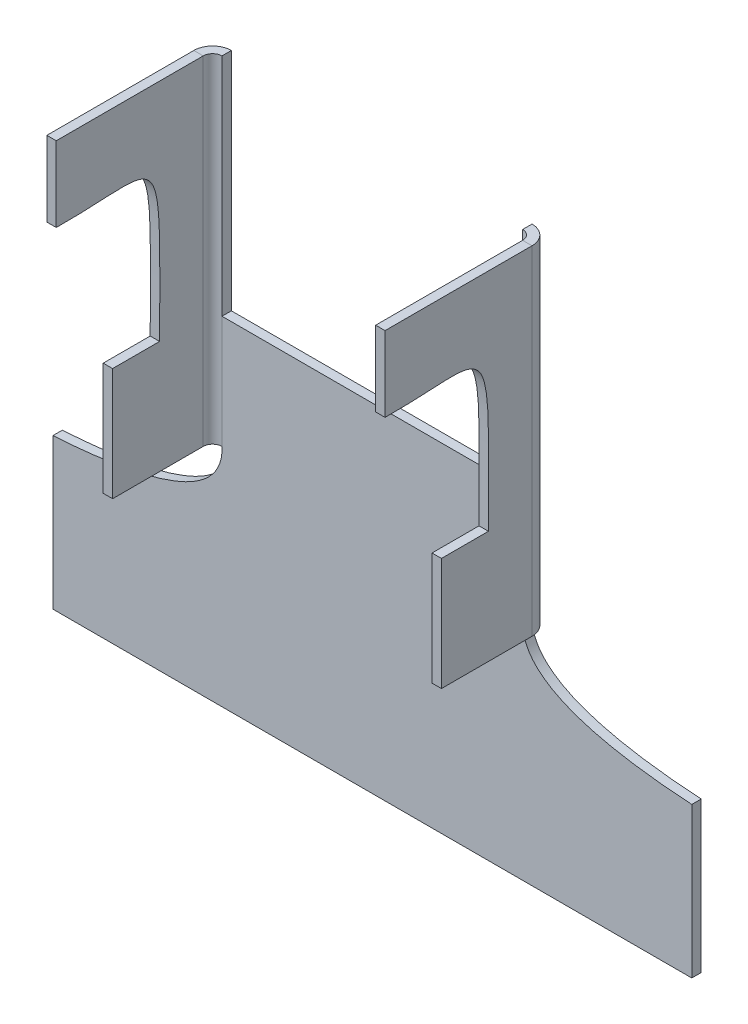
ISO-10303-21;
HEADER;
FILE_DESCRIPTION(('STEP AP214'),'2;1');
FILE_NAME('part.step','',(''),(''),'','','');
FILE_SCHEMA(('AUTOMOTIVE_DESIGN { 1 0 10303 214 1 1 1 1 }'));
ENDSEC;
DATA;
#1=APPLICATION_CONTEXT('core data for automotive mechanical design processes');
#2=APPLICATION_PROTOCOL_DEFINITION('international standard','automotive_design',2000,#1);
#3=PRODUCT_CONTEXT('',#1,'mechanical');
#4=PRODUCT('Part','Part','',(#3));
#5=PRODUCT_RELATED_PRODUCT_CATEGORY('part','',(#4));
#6=PRODUCT_DEFINITION_FORMATION('','',#4);
#7=PRODUCT_DEFINITION_CONTEXT('part definition',#1,'design');
#8=PRODUCT_DEFINITION('design','',#6,#7);
#9=PRODUCT_DEFINITION_SHAPE('','',#8);
#10=(LENGTH_UNIT() NAMED_UNIT(*) SI_UNIT(.MILLI.,.METRE.));
#11=(NAMED_UNIT(*) PLANE_ANGLE_UNIT() SI_UNIT($,.RADIAN.));
#12=(NAMED_UNIT(*) SI_UNIT($,.STERADIAN.) SOLID_ANGLE_UNIT());
#13=UNCERTAINTY_MEASURE_WITH_UNIT(LENGTH_MEASURE(1.E-05),#10,'distance_accuracy_value','');
#14=(GEOMETRIC_REPRESENTATION_CONTEXT(3) GLOBAL_UNCERTAINTY_ASSIGNED_CONTEXT((#13)) GLOBAL_UNIT_ASSIGNED_CONTEXT((#10,
#11,#12)) REPRESENTATION_CONTEXT('',''));
#15=CARTESIAN_POINT('',(0.,0.,0.));
#16=DIRECTION('',(0.,0.,1.));
#17=DIRECTION('',(1.,0.,0.));
#18=AXIS2_PLACEMENT_3D('',#15,#16,#17);
#19=CARTESIAN_POINT('',(84.8300814883763,84.4847846617925,-3.175));
#20=DIRECTION('',(0.,0.,1.));
#21=DIRECTION('',(1.,0.,0.));
#22=AXIS2_PLACEMENT_3D('',#19,#20,#21);
#23=PLANE('',#22);
#24=DIRECTION('',(-1.,0.,0.));
#25=VECTOR('',#24,1.);
#26=CARTESIAN_POINT('',(-42.4525662577424,35.8220109467431,-3.175));
#27=LINE('',#26,#25);
#28=CARTESIAN_POINT('',(59.1474337422576,35.8220109467432,-3.175));
#29=VERTEX_POINT('',#28);
#30=CARTESIAN_POINT('',(-42.4525662577424,35.8220109467431,-3.175));
#31=VERTEX_POINT('',#30);
#32=EDGE_CURVE('E69',#29,#31,#27,.T.);
#33=ORIENTED_EDGE('',*,*,#32,.F.);
#34=DIRECTION('',(0.,-1.,0.));
#35=VECTOR('',#34,1.);
#36=CARTESIAN_POINT('',(59.1474337422576,84.4847846617925,-3.175));
#37=LINE('',#36,#35);
#38=CARTESIAN_POINT('',(59.1474337422576,-2.27798905325685,-3.175));
#39=VERTEX_POINT('',#38);
#40=EDGE_CURVE('E386',#29,#39,#37,.T.);
#41=ORIENTED_EDGE('',*,*,#40,.T.);
#42=CARTESIAN_POINT('',(116.297433742258,-27.6779890532568,-3.175));
#43=CARTESIAN_POINT('',(58.2426435123151,-24.0057964597718,-3.175));
#44=CARTESIAN_POINT('',(59.1474337422576,-2.27798905325685,-3.175));
#45=B_SPLINE_CURVE_WITH_KNOTS('',2,(#42,#43,#44),.UNSPECIFIED.,.F.,.F.,(3,3),(0.,1.),.UNSPECIFIED.);
#46=CARTESIAN_POINT('',(116.297433742258,-27.6779890532569,-3.175));
#47=VERTEX_POINT('',#46);
#48=EDGE_CURVE('E277',#47,#39,#45,.T.);
#49=ORIENTED_EDGE('',*,*,#48,.F.);
#50=DIRECTION('',(0.,1.,0.));
#51=VECTOR('',#50,1.);
#52=CARTESIAN_POINT('',(116.297433742258,-78.4779890532568,-3.175));
#53=LINE('',#52,#51);
#54=CARTESIAN_POINT('',(116.297433742258,-78.4779890532568,-3.175));
#55=VERTEX_POINT('',#54);
#56=EDGE_CURVE('E513',#55,#47,#53,.T.);
#57=ORIENTED_EDGE('',*,*,#56,.F.);
#58=DIRECTION('',(1.,0.,0.));
#59=VECTOR('',#58,1.);
#60=CARTESIAN_POINT('',(-99.6025662577424,-78.4779890532568,-3.175));
#61=LINE('',#60,#59);
#62=CARTESIAN_POINT('',(-99.6025662577424,-78.4779890532568,-3.175));
#63=VERTEX_POINT('',#62);
#64=EDGE_CURVE('E517',#63,#55,#61,.T.);
#65=ORIENTED_EDGE('',*,*,#64,.F.);
#66=DIRECTION('',(0.,-1.,0.));
#67=VECTOR('',#66,1.);
#68=CARTESIAN_POINT('',(-99.6025662577424,-78.4779890532568,-3.175));
#69=LINE('',#68,#67);
#70=CARTESIAN_POINT('',(-99.6025662577424,-27.6779890532569,-3.175));
#71=VERTEX_POINT('',#70);
#72=EDGE_CURVE('E488',#71,#63,#69,.T.);
#73=ORIENTED_EDGE('',*,*,#72,.F.);
#74=CARTESIAN_POINT('',(-42.4525662577424,-2.27798905325686,-3.175));
#75=CARTESIAN_POINT('',(-41.5477760277999,-24.0057964597718,-3.175));
#76=CARTESIAN_POINT('',(-99.6025662577424,-27.6779890532569,-3.175));
#77=B_SPLINE_CURVE_WITH_KNOTS('',2,(#74,#75,#76),.UNSPECIFIED.,.F.,.F.,(3,3),(0.,1.),.UNSPECIFIED.);
#78=CARTESIAN_POINT('',(-42.4525662577424,-2.27798905325687,-3.175));
#79=VERTEX_POINT('',#78);
#80=EDGE_CURVE('E285',#79,#71,#77,.T.);
#81=ORIENTED_EDGE('',*,*,#80,.F.);
#82=DIRECTION('',(0.,1.,0.));
#83=VECTOR('',#82,1.);
#84=CARTESIAN_POINT('',(-42.4525662577424,84.4847846617926,-3.175));
#85=LINE('',#84,#83);
#86=EDGE_CURVE('E283',#79,#31,#85,.T.);
#87=ORIENTED_EDGE('',*,*,#86,.T.);
#88=EDGE_LOOP('',(#33,#41,#49,#57,#65,#73,#81,#87));
#89=FACE_BOUND('',#88,.T.);
#90=ADVANCED_FACE('F45',(#89),#23,.F.);
#91=CARTESIAN_POINT('',(-48.8025662577422,112.022010946743,52.8440824936393));
#92=DIRECTION('',(0.,1.,0.));
#93=DIRECTION('',(1.,0.,0.));
#94=AXIS2_PLACEMENT_3D('',#91,#92,#93);
#95=PLANE('',#94);
#96=DIRECTION('',(0.,0.,1.));
#97=VECTOR('',#96,1.);
#98=CARTESIAN_POINT('',(-45.6275662577422,112.022010946743,52.8440824936393));
#99=LINE('',#98,#97);
#100=CARTESIAN_POINT('',(-45.6275662577424,112.022010946743,3.175));
#101=VERTEX_POINT('',#100);
#102=CARTESIAN_POINT('',(-45.6275662577422,112.022010946743,52.8440824936393));
#103=VERTEX_POINT('',#102);
#104=EDGE_CURVE('E349',#101,#103,#99,.T.);
#105=ORIENTED_EDGE('',*,*,#104,.F.);
#106=DIRECTION('',(-1.,0.,0.));
#107=VECTOR('',#106,1.);
#108=CARTESIAN_POINT('',(-48.8025662577424,112.022010946743,3.17500000000001));
#109=LINE('',#108,#107);
#110=CARTESIAN_POINT('',(-48.8025662577424,112.022010946743,3.17500000000004));
#111=VERTEX_POINT('',#110);
#112=EDGE_CURVE('E378',#101,#111,#109,.T.);
#113=ORIENTED_EDGE('',*,*,#112,.T.);
#114=DIRECTION('',(0.,0.,1.));
#115=VECTOR('',#114,1.);
#116=CARTESIAN_POINT('',(-48.8025662577422,112.022010946743,52.8440824936393));
#117=LINE('',#116,#115);
#118=CARTESIAN_POINT('',(-48.8025662577422,112.022010946743,52.8440824936393));
#119=VERTEX_POINT('',#118);
#120=EDGE_CURVE('E392',#111,#119,#117,.T.);
#121=ORIENTED_EDGE('',*,*,#120,.T.);
#122=DIRECTION('',(1.,0.,0.));
#123=VECTOR('',#122,1.);
#124=CARTESIAN_POINT('',(-48.8025662577422,112.022010946743,52.8440824936393));
#125=LINE('',#124,#123);
#126=EDGE_CURVE('E373',#119,#103,#125,.T.);
#127=ORIENTED_EDGE('',*,*,#126,.T.);
#128=EDGE_LOOP('',(#105,#113,#121,#127));
#129=FACE_BOUND('',#128,.T.);
#130=ADVANCED_FACE('F557',(#129),#95,.T.);
#131=CARTESIAN_POINT('',(-48.8025662577423,-2.27798905325687,33.7940824936393));
#132=DIRECTION('',(0.,-1.,0.));
#133=DIRECTION('',(-1.,0.,0.));
#134=AXIS2_PLACEMENT_3D('',#131,#132,#133);
#135=PLANE('',#134);
#136=DIRECTION('',(0.,0.,-1.));
#137=VECTOR('',#136,1.);
#138=CARTESIAN_POINT('',(-48.8025662577423,-2.27798905325687,33.7940824936393));
#139=LINE('',#138,#137);
#140=CARTESIAN_POINT('',(-48.8025662577423,-2.27798905325687,33.7940824936393));
#141=VERTEX_POINT('',#140);
#142=CARTESIAN_POINT('',(-48.8025662577424,-2.27798905325686,3.17499999999998));
#143=VERTEX_POINT('',#142);
#144=EDGE_CURVE('E344',#141,#143,#139,.T.);
#145=ORIENTED_EDGE('',*,*,#144,.T.);
#146=DIRECTION('',(1.,0.,0.));
#147=VECTOR('',#146,1.);
#148=CARTESIAN_POINT('',(-48.8025662577424,-2.27798905325686,3.17500000000001));
#149=LINE('',#148,#147);
#150=CARTESIAN_POINT('',(-45.6275662577424,-2.27798905325686,3.175));
#151=VERTEX_POINT('',#150);
#152=EDGE_CURVE('E383',#143,#151,#149,.T.);
#153=ORIENTED_EDGE('',*,*,#152,.T.);
#154=DIRECTION('',(0.,0.,-1.));
#155=VECTOR('',#154,1.);
#156=CARTESIAN_POINT('',(-45.6275662577423,-2.27798905325687,33.7940824936393));
#157=LINE('',#156,#155);
#158=CARTESIAN_POINT('',(-45.6275662577423,-2.27798905325687,33.7940824936393));
#159=VERTEX_POINT('',#158);
#160=EDGE_CURVE('E363',#159,#151,#157,.T.);
#161=ORIENTED_EDGE('',*,*,#160,.F.);
#162=DIRECTION('',(1.,0.,0.));
#163=VECTOR('',#162,1.);
#164=CARTESIAN_POINT('',(-48.8025662577423,-2.27798905325687,33.7940824936393));
#165=LINE('',#164,#163);
#166=EDGE_CURVE('E364',#141,#159,#165,.T.);
#167=ORIENTED_EDGE('',*,*,#166,.F.);
#168=EDGE_LOOP('',(#145,#153,#161,#167));
#169=FACE_BOUND('',#168,.T.);
#170=ADVANCED_FACE('F570',(#169),#135,.T.);
#171=CARTESIAN_POINT('',(-45.6275662577429,84.4847846617926,-131.588565252479));
#172=DIRECTION('',(1.,0.,0.));
#173=DIRECTION('',(0.,0.,-1.));
#174=AXIS2_PLACEMENT_3D('',#171,#172,#173);
#175=PLANE('',#174);
#176=ORIENTED_EDGE('',*,*,#160,.T.);
#177=DIRECTION('',(0.,1.,0.));
#178=VECTOR('',#177,1.);
#179=CARTESIAN_POINT('',(-45.6275662577424,84.4847846617926,3.17499999999998));
#180=LINE('',#179,#178);
#181=EDGE_CURVE('E380',#151,#101,#180,.T.);
#182=ORIENTED_EDGE('',*,*,#181,.T.);
#183=ORIENTED_EDGE('',*,*,#104,.T.);
#184=DIRECTION('',(0.,-1.,0.));
#185=VECTOR('',#184,1.);
#186=CARTESIAN_POINT('',(-45.6275662577422,112.022010946743,52.8440824936393));
#187=LINE('',#186,#185);
#188=CARTESIAN_POINT('',(-45.6275662577422,86.6220109467431,52.8440824936393));
#189=VERTEX_POINT('',#188);
#190=EDGE_CURVE('E345',#103,#189,#187,.T.);
#191=ORIENTED_EDGE('',*,*,#190,.T.);
#192=CARTESIAN_POINT('',(-45.6275662577422,86.6220109467431,52.8440824936393));
#193=CARTESIAN_POINT('',(-45.6275662577424,86.0916431492241,15.7336539194704));
#194=CARTESIAN_POINT('',(-45.6275662577424,98.3864419843938,17.6832383907914));
#195=CARTESIAN_POINT('',(-45.6275662577424,35.8220109467431,17.9190824936393));
#196=B_SPLINE_CURVE_WITH_KNOTS('',3,(#192,#193,#194,#195),.UNSPECIFIED.,.F.,.F.,(4,4),(0.,1.),.UNSPECIFIED.);
#197=CARTESIAN_POINT('',(-45.6275662577424,35.8220109467431,17.9190824936393));
#198=VERTEX_POINT('',#197);
#199=EDGE_CURVE('E348',#189,#198,#196,.T.);
#200=ORIENTED_EDGE('',*,*,#199,.T.);
#201=DIRECTION('',(0.,0.,1.));
#202=VECTOR('',#201,1.);
#203=CARTESIAN_POINT('',(-45.6275662577423,35.8220109467431,33.7940824936393));
#204=LINE('',#203,#202);
#205=CARTESIAN_POINT('',(-45.6275662577423,35.8220109467431,33.7940824936393));
#206=VERTEX_POINT('',#205);
#207=EDGE_CURVE('E354',#198,#206,#204,.T.);
#208=ORIENTED_EDGE('',*,*,#207,.T.);
#209=DIRECTION('',(0.,-1.,0.));
#210=VECTOR('',#209,1.);
#211=CARTESIAN_POINT('',(-45.6275662577423,-2.27798905325687,33.7940824936393));
#212=LINE('',#211,#210);
#213=EDGE_CURVE('E360',#206,#159,#212,.T.);
#214=ORIENTED_EDGE('',*,*,#213,.T.);
#215=EDGE_LOOP('',(#176,#182,#183,#191,#200,#208,#214));
#216=FACE_BOUND('',#215,.T.);
#217=ADVANCED_FACE('F314',(#216),#175,.T.);
#218=CARTESIAN_POINT('',(-48.8025662577423,-2.27798905325687,33.7940824936393));
#219=DIRECTION('',(0.,0.,1.));
#220=DIRECTION('',(1.,0.,0.));
#221=AXIS2_PLACEMENT_3D('',#218,#219,#220);
#222=PLANE('',#221);
#223=ORIENTED_EDGE('',*,*,#213,.F.);
#224=DIRECTION('',(1.,0.,0.));
#225=VECTOR('',#224,1.);
#226=CARTESIAN_POINT('',(-48.8025662577423,35.8220109467431,33.7940824936393));
#227=LINE('',#226,#225);
#228=CARTESIAN_POINT('',(-48.8025662577423,35.8220109467431,33.7940824936393));
#229=VERTEX_POINT('',#228);
#230=EDGE_CURVE('E367',#229,#206,#227,.T.);
#231=ORIENTED_EDGE('',*,*,#230,.F.);
#232=DIRECTION('',(0.,-1.,0.));
#233=VECTOR('',#232,1.);
#234=CARTESIAN_POINT('',(-48.8025662577423,-2.27798905325687,33.7940824936393));
#235=LINE('',#234,#233);
#236=EDGE_CURVE('E341',#229,#141,#235,.T.);
#237=ORIENTED_EDGE('',*,*,#236,.T.);
#238=ORIENTED_EDGE('',*,*,#166,.T.);
#239=EDGE_LOOP('',(#223,#231,#237,#238));
#240=FACE_BOUND('',#239,.T.);
#241=ADVANCED_FACE('F310',(#240),#222,.T.);
#242=CARTESIAN_POINT('',(-48.8025662577423,35.8220109467431,33.7940824936393));
#243=DIRECTION('',(0.,1.,0.));
#244=DIRECTION('',(1.,0.,0.));
#245=AXIS2_PLACEMENT_3D('',#242,#243,#244);
#246=PLANE('',#245);
#247=ORIENTED_EDGE('',*,*,#207,.F.);
#248=DIRECTION('',(1.,0.,0.));
#249=VECTOR('',#248,1.);
#250=CARTESIAN_POINT('',(-48.8025662577424,35.8220109467431,17.9190824936393));
#251=LINE('',#250,#249);
#252=CARTESIAN_POINT('',(-48.8025662577424,35.8220109467431,17.9190824936393));
#253=VERTEX_POINT('',#252);
#254=EDGE_CURVE('E369',#253,#198,#251,.T.);
#255=ORIENTED_EDGE('',*,*,#254,.F.);
#256=DIRECTION('',(0.,0.,1.));
#257=VECTOR('',#256,1.);
#258=CARTESIAN_POINT('',(-48.8025662577423,35.8220109467431,33.7940824936393));
#259=LINE('',#258,#257);
#260=EDGE_CURVE('E333',#253,#229,#259,.T.);
#261=ORIENTED_EDGE('',*,*,#260,.T.);
#262=ORIENTED_EDGE('',*,*,#230,.T.);
#263=EDGE_LOOP('',(#247,#255,#261,#262));
#264=FACE_BOUND('',#263,.T.);
#265=ADVANCED_FACE('F313',(#264),#246,.T.);
#266=CARTESIAN_POINT('',(-48.8025662577422,86.6220109467431,52.8440824936393));
#267=CARTESIAN_POINT('',(-48.8025662577424,86.0916431492241,15.7336539194704));
#268=CARTESIAN_POINT('',(-48.8025662577424,98.3864419843938,17.6832383907915));
#269=CARTESIAN_POINT('',(-48.8025662577424,35.8220109467431,17.9190824936393));
#270=B_SPLINE_CURVE_WITH_KNOTS('',3,(#266,#267,#268,#269),.UNSPECIFIED.,.F.,.F.,(4,4),(0.,1.),.UNSPECIFIED.);
#271=DIRECTION('',(1.,0.,0.));
#272=VECTOR('',#271,1.);
#273=SURFACE_OF_LINEAR_EXTRUSION('',#270,#272);
#274=ORIENTED_EDGE('',*,*,#199,.F.);
#275=DIRECTION('',(1.,0.,0.));
#276=VECTOR('',#275,1.);
#277=CARTESIAN_POINT('',(-48.8025662577422,86.6220109467431,52.8440824936393));
#278=LINE('',#277,#276);
#279=CARTESIAN_POINT('',(-48.8025662577422,86.6220109467431,52.8440824936393));
#280=VERTEX_POINT('',#279);
#281=EDGE_CURVE('E371',#280,#189,#278,.T.);
#282=ORIENTED_EDGE('',*,*,#281,.F.);
#283=EDGE_CURVE('E326',#280,#253,#270,.T.);
#284=ORIENTED_EDGE('',*,*,#283,.T.);
#285=ORIENTED_EDGE('',*,*,#254,.T.);
#286=EDGE_LOOP('',(#274,#282,#284,#285));
#287=FACE_BOUND('',#286,.T.);
#288=ADVANCED_FACE('F318',(#287),#273,.T.);
#289=CARTESIAN_POINT('',(-48.8025662577422,112.022010946743,52.8440824936393));
#290=DIRECTION('',(0.,0.,1.));
#291=DIRECTION('',(0.,-1.,0.));
#292=AXIS2_PLACEMENT_3D('',#289,#290,#291);
#293=PLANE('',#292);
#294=ORIENTED_EDGE('',*,*,#190,.F.);
#295=ORIENTED_EDGE('',*,*,#126,.F.);
#296=DIRECTION('',(0.,-1.,0.));
#297=VECTOR('',#296,1.);
#298=CARTESIAN_POINT('',(-48.8025662577422,112.022010946743,52.8440824936393));
#299=LINE('',#298,#297);
#300=EDGE_CURVE('E334',#119,#280,#299,.T.);
#301=ORIENTED_EDGE('',*,*,#300,.T.);
#302=ORIENTED_EDGE('',*,*,#281,.T.);
#303=EDGE_LOOP('',(#294,#295,#301,#302));
#304=FACE_BOUND('',#303,.T.);
#305=ADVANCED_FACE('F323',(#304),#293,.T.);
#306=CARTESIAN_POINT('',(-48.8025662577429,84.4847846617926,-131.588565252479));
#307=DIRECTION('',(1.,0.,0.));
#308=DIRECTION('',(0.,0.,-1.));
#309=AXIS2_PLACEMENT_3D('',#306,#307,#308);
#310=PLANE('',#309);
#311=DIRECTION('',(0.,1.,0.));
#312=VECTOR('',#311,1.);
#313=CARTESIAN_POINT('',(-48.8025662577424,84.4847846617926,3.175));
#314=LINE('',#313,#312);
#315=EDGE_CURVE('E366',#143,#111,#314,.T.);
#316=ORIENTED_EDGE('',*,*,#315,.F.);
#317=ORIENTED_EDGE('',*,*,#144,.F.);
#318=ORIENTED_EDGE('',*,*,#236,.F.);
#319=ORIENTED_EDGE('',*,*,#260,.F.);
#320=ORIENTED_EDGE('',*,*,#283,.F.);
#321=ORIENTED_EDGE('',*,*,#300,.F.);
#322=ORIENTED_EDGE('',*,*,#120,.F.);
#323=EDGE_LOOP('',(#316,#317,#318,#319,#320,#321,#322));
#324=FACE_BOUND('',#323,.T.);
#325=ADVANCED_FACE('F561',(#324),#310,.F.);
#326=CARTESIAN_POINT('',(-99.6025662577424,-78.4779890532568,-3.175));
#327=DIRECTION('',(-1.,0.,0.));
#328=DIRECTION('',(0.,0.,1.));
#329=AXIS2_PLACEMENT_3D('',#326,#327,#328);
#330=PLANE('',#329);
#331=DIRECTION('',(0.,-1.,0.));
#332=VECTOR('',#331,1.);
#333=CARTESIAN_POINT('',(-99.6025662577424,-78.4779890532568,0.));
#334=LINE('',#333,#332);
#335=CARTESIAN_POINT('',(-99.6025662577424,-27.6779890532569,0.));
#336=VERTEX_POINT('',#335);
#337=CARTESIAN_POINT('',(-99.6025662577424,-78.4779890532568,0.));
#338=VERTEX_POINT('',#337);
#339=EDGE_CURVE('E541',#336,#338,#334,.T.);
#340=ORIENTED_EDGE('',*,*,#339,.F.);
#341=DIRECTION('',(0.,0.,1.));
#342=VECTOR('',#341,1.);
#343=CARTESIAN_POINT('',(-99.6025662577424,-27.6779890532569,-3.175));
#344=LINE('',#343,#342);
#345=EDGE_CURVE('E390',#71,#336,#344,.T.);
#346=ORIENTED_EDGE('',*,*,#345,.F.);
#347=ORIENTED_EDGE('',*,*,#72,.T.);
#348=DIRECTION('',(0.,0.,1.));
#349=VECTOR('',#348,1.);
#350=CARTESIAN_POINT('',(-99.6025662577424,-78.4779890532568,-3.175));
#351=LINE('',#350,#349);
#352=EDGE_CURVE('E519',#63,#338,#351,.T.);
#353=ORIENTED_EDGE('',*,*,#352,.T.);
#354=EDGE_LOOP('',(#340,#346,#347,#353));
#355=FACE_BOUND('',#354,.T.);
#356=ADVANCED_FACE('F525',(#355),#330,.T.);
#357=CARTESIAN_POINT('',(-99.6025662577424,-78.4779890532568,-3.175));
#358=DIRECTION('',(0.,-1.,0.));
#359=DIRECTION('',(0.,0.,-1.));
#360=AXIS2_PLACEMENT_3D('',#357,#358,#359);
#361=PLANE('',#360);
#362=DIRECTION('',(1.,0.,0.));
#363=VECTOR('',#362,1.);
#364=CARTESIAN_POINT('',(-99.6025662577424,-78.4779890532568,0.));
#365=LINE('',#364,#363);
#366=CARTESIAN_POINT('',(116.297433742258,-78.4779890532568,0.));
#367=VERTEX_POINT('',#366);
#368=EDGE_CURVE('E539',#338,#367,#365,.T.);
#369=ORIENTED_EDGE('',*,*,#368,.F.);
#370=ORIENTED_EDGE('',*,*,#352,.F.);
#371=ORIENTED_EDGE('',*,*,#64,.T.);
#372=DIRECTION('',(0.,0.,1.));
#373=VECTOR('',#372,1.);
#374=CARTESIAN_POINT('',(116.297433742258,-78.4779890532568,-3.175));
#375=LINE('',#374,#373);
#376=EDGE_CURVE('E515',#55,#367,#375,.T.);
#377=ORIENTED_EDGE('',*,*,#376,.T.);
#378=EDGE_LOOP('',(#369,#370,#371,#377));
#379=FACE_BOUND('',#378,.T.);
#380=ADVANCED_FACE('F631',(#379),#361,.T.);
#381=CARTESIAN_POINT('',(116.297433742258,-78.4779890532568,-3.175));
#382=DIRECTION('',(1.,0.,0.));
#383=DIRECTION('',(0.,0.,-1.));
#384=AXIS2_PLACEMENT_3D('',#381,#382,#383);
#385=PLANE('',#384);
#386=DIRECTION('',(0.,1.,0.));
#387=VECTOR('',#386,1.);
#388=CARTESIAN_POINT('',(116.297433742258,-78.4779890532568,0.));
#389=LINE('',#388,#387);
#390=CARTESIAN_POINT('',(116.297433742258,-27.6779890532569,0.));
#391=VERTEX_POINT('',#390);
#392=EDGE_CURVE('E534',#367,#391,#389,.T.);
#393=ORIENTED_EDGE('',*,*,#392,.F.);
#394=ORIENTED_EDGE('',*,*,#376,.F.);
#395=ORIENTED_EDGE('',*,*,#56,.T.);
#396=DIRECTION('',(0.,0.,1.));
#397=VECTOR('',#396,1.);
#398=CARTESIAN_POINT('',(116.297433742258,-27.6779890532569,-3.175));
#399=LINE('',#398,#397);
#400=EDGE_CURVE('E284',#47,#391,#399,.T.);
#401=ORIENTED_EDGE('',*,*,#400,.T.);
#402=EDGE_LOOP('',(#393,#394,#395,#401));
#403=FACE_BOUND('',#402,.T.);
#404=ADVANCED_FACE('F299',(#403),#385,.T.);
#405=DIRECTION('',(0.,0.,1.));
#406=VECTOR('',#405,1.);
#407=SURFACE_OF_LINEAR_EXTRUSION('',#45,#406);
#408=CARTESIAN_POINT('',(116.297433742258,-27.6779890532568,0.));
#409=CARTESIAN_POINT('',(58.2426435123151,-24.0057964597718,0.));
#410=CARTESIAN_POINT('',(59.1474337422576,-2.27798905325685,0.));
#411=B_SPLINE_CURVE_WITH_KNOTS('',2,(#408,#409,#410),.UNSPECIFIED.,.F.,.F.,(3,3),(0.,1.),.UNSPECIFIED.);
#412=CARTESIAN_POINT('',(59.1474337422576,-2.27798905325685,0.));
#413=VERTEX_POINT('',#412);
#414=EDGE_CURVE('E62',#391,#413,#411,.T.);
#415=ORIENTED_EDGE('',*,*,#414,.F.);
#416=ORIENTED_EDGE('',*,*,#400,.F.);
#417=ORIENTED_EDGE('',*,*,#48,.T.);
#418=DIRECTION('',(0.,0.,1.));
#419=VECTOR('',#418,1.);
#420=CARTESIAN_POINT('',(59.1474337422576,-2.27798905325685,-3.175));
#421=LINE('',#420,#419);
#422=EDGE_CURVE('E12',#39,#413,#421,.T.);
#423=ORIENTED_EDGE('',*,*,#422,.T.);
#424=EDGE_LOOP('',(#415,#416,#417,#423));
#425=FACE_BOUND('',#424,.T.);
#426=ADVANCED_FACE('F294',(#425),#407,.T.);
#427=CARTESIAN_POINT('',(-42.4525662577424,35.8220109467431,-3.175));
#428=DIRECTION('',(0.,1.,0.));
#429=DIRECTION('',(-1.,0.,0.));
#430=AXIS2_PLACEMENT_3D('',#427,#428,#429);
#431=PLANE('',#430);
#432=DIRECTION('',(-1.,0.,0.));
#433=VECTOR('',#432,1.);
#434=CARTESIAN_POINT('',(-42.4525662577424,35.8220109467431,0.));
#435=LINE('',#434,#433);
#436=CARTESIAN_POINT('',(59.1474337422576,35.8220109467433,0.));
#437=VERTEX_POINT('',#436);
#438=CARTESIAN_POINT('',(-42.4525662577424,35.8220109467431,0.));
#439=VERTEX_POINT('',#438);
#440=EDGE_CURVE('E495',#437,#439,#435,.T.);
#441=ORIENTED_EDGE('',*,*,#440,.F.);
#442=DIRECTION('',(0.,0.,1.));
#443=VECTOR('',#442,1.);
#444=CARTESIAN_POINT('',(59.1474337422576,35.8220109467432,-3.175));
#445=LINE('',#444,#443);
#446=EDGE_CURVE('E397',#29,#437,#445,.T.);
#447=ORIENTED_EDGE('',*,*,#446,.F.);
#448=ORIENTED_EDGE('',*,*,#32,.T.);
#449=DIRECTION('',(0.,0.,1.));
#450=VECTOR('',#449,1.);
#451=CARTESIAN_POINT('',(-42.4525662577424,35.8220109467431,-3.175));
#452=LINE('',#451,#450);
#453=EDGE_CURVE('E500',#31,#439,#452,.T.);
#454=ORIENTED_EDGE('',*,*,#453,.T.);
#455=EDGE_LOOP('',(#441,#447,#448,#454));
#456=FACE_BOUND('',#455,.T.);
#457=ADVANCED_FACE('F298',(#456),#431,.T.);
#458=CARTESIAN_POINT('',(84.8300814883763,84.4847846617925,0.));
#459=DIRECTION('',(0.,0.,1.));
#460=DIRECTION('',(1.,0.,0.));
#461=AXIS2_PLACEMENT_3D('',#458,#459,#460);
#462=PLANE('',#461);
#463=DIRECTION('',(0.,-1.,0.));
#464=VECTOR('',#463,1.);
#465=CARTESIAN_POINT('',(59.1474337422576,84.4847846617925,0.));
#466=LINE('',#465,#464);
#467=EDGE_CURVE('E54',#437,#413,#466,.T.);
#468=ORIENTED_EDGE('',*,*,#467,.F.);
#469=ORIENTED_EDGE('',*,*,#440,.T.);
#470=DIRECTION('',(0.,1.,0.));
#471=VECTOR('',#470,1.);
#472=CARTESIAN_POINT('',(-42.4525662577424,84.4847846617926,0.));
#473=LINE('',#472,#471);
#474=CARTESIAN_POINT('',(-42.4525662577424,-2.27798905325687,0.));
#475=VERTEX_POINT('',#474);
#476=EDGE_CURVE('E483',#475,#439,#473,.T.);
#477=ORIENTED_EDGE('',*,*,#476,.F.);
#478=CARTESIAN_POINT('',(-42.4525662577424,-2.27798905325686,0.));
#479=CARTESIAN_POINT('',(-41.5477760277999,-24.0057964597718,0.));
#480=CARTESIAN_POINT('',(-99.6025662577424,-27.6779890532569,0.));
#481=B_SPLINE_CURVE_WITH_KNOTS('',2,(#478,#479,#480),.UNSPECIFIED.,.F.,.F.,(3,3),(0.,1.),.UNSPECIFIED.);
#482=EDGE_CURVE('E504',#475,#336,#481,.T.);
#483=ORIENTED_EDGE('',*,*,#482,.T.);
#484=ORIENTED_EDGE('',*,*,#339,.T.);
#485=ORIENTED_EDGE('',*,*,#368,.T.);
#486=ORIENTED_EDGE('',*,*,#392,.T.);
#487=ORIENTED_EDGE('',*,*,#414,.T.);
#488=EDGE_LOOP('',(#468,#469,#477,#483,#484,#485,#486,#487));
#489=FACE_BOUND('',#488,.T.);
#490=ADVANCED_FACE('F47',(#489),#462,.T.);
#491=DIRECTION('',(0.,0.,1.));
#492=VECTOR('',#491,1.);
#493=SURFACE_OF_LINEAR_EXTRUSION('',#77,#492);
#494=ORIENTED_EDGE('',*,*,#482,.F.);
#495=DIRECTION('',(0.,0.,1.));
#496=VECTOR('',#495,1.);
#497=CARTESIAN_POINT('',(-42.4525662577424,-2.27798905325686,-3.175));
#498=LINE('',#497,#496);
#499=EDGE_CURVE('E480',#79,#475,#498,.T.);
#500=ORIENTED_EDGE('',*,*,#499,.F.);
#501=ORIENTED_EDGE('',*,*,#80,.T.);
#502=ORIENTED_EDGE('',*,*,#345,.T.);
#503=EDGE_LOOP('',(#494,#500,#501,#502));
#504=FACE_BOUND('',#503,.T.);
#505=ADVANCED_FACE('F305',(#504),#493,.T.);
#506=CARTESIAN_POINT('',(-42.4525662577424,54.8720109467431,-3.175));
#507=DIRECTION('',(1.,0.,0.));
#508=DIRECTION('',(0.,-1.,0.));
#509=AXIS2_PLACEMENT_3D('',#506,#507,#508);
#510=PLANE('',#509);
#511=ORIENTED_EDGE('',*,*,#453,.F.);
#512=DIRECTION('',(0.,-1.,0.));
#513=VECTOR('',#512,1.);
#514=CARTESIAN_POINT('',(-42.4525662577424,-2.27798905325686,-3.175));
#515=LINE('',#514,#513);
#516=CARTESIAN_POINT('',(-42.4525662577424,112.022010946743,-3.175));
#517=VERTEX_POINT('',#516);
#518=EDGE_CURVE('E265',#517,#31,#515,.T.);
#519=ORIENTED_EDGE('',*,*,#518,.F.);
#520=DIRECTION('',(0.,0.,-1.));
#521=VECTOR('',#520,1.);
#522=CARTESIAN_POINT('',(-42.4525662577424,112.022010946743,-3.175));
#523=LINE('',#522,#521);
#524=CARTESIAN_POINT('',(-42.4525662577424,112.022010946743,0.));
#525=VERTEX_POINT('',#524);
#526=EDGE_CURVE('E274',#525,#517,#523,.T.);
#527=ORIENTED_EDGE('',*,*,#526,.F.);
#528=DIRECTION('',(0.,1.,0.));
#529=VECTOR('',#528,1.);
#530=CARTESIAN_POINT('',(-42.4525662577424,-59.71653451805,0.));
#531=LINE('',#530,#529);
#532=EDGE_CURVE('E262',#525,#439,#531,.F.);
#533=ORIENTED_EDGE('',*,*,#532,.T.);
#534=EDGE_LOOP('',(#511,#519,#527,#533));
#535=FACE_BOUND('',#534,.T.);
#536=ADVANCED_FACE('F308',(#535),#510,.T.);
#537=CARTESIAN_POINT('',(-42.4525662577424,-2.27798905325687,3.175));
#538=DIRECTION('',(0.,-1.,0.));
#539=DIRECTION('',(1.,0.,0.));
#540=AXIS2_PLACEMENT_3D('',#537,#538,#539);
#541=PLANE('',#540);
#542=ORIENTED_EDGE('',*,*,#499,.T.);
#543=CARTESIAN_POINT('',(-42.4525662577424,-2.27798905325687,3.175));
#544=DIRECTION('',(0.,1.,0.));
#545=DIRECTION('',(-1.,0.,0.));
#546=AXIS2_PLACEMENT_3D('',#543,#544,#545);
#547=CIRCLE('',#546,3.175);
#548=EDGE_CURVE('E471',#475,#151,#547,.T.);
#549=ORIENTED_EDGE('',*,*,#548,.T.);
#550=ORIENTED_EDGE('',*,*,#152,.F.);
#551=CARTESIAN_POINT('',(-42.4525662577424,-2.27798905325687,3.175));
#552=DIRECTION('',(0.,1.,0.));
#553=DIRECTION('',(1.,0.,0.));
#554=AXIS2_PLACEMENT_3D('',#551,#552,#553);
#555=CIRCLE('',#554,6.35);
#556=EDGE_CURVE('E258',#79,#143,#555,.T.);
#557=ORIENTED_EDGE('',*,*,#556,.F.);
#558=EDGE_LOOP('',(#542,#549,#550,#557));
#559=FACE_BOUND('',#558,.T.);
#560=ADVANCED_FACE('F568',(#559),#541,.T.);
#561=CARTESIAN_POINT('',(-42.4525662577424,112.022010946743,3.175));
#562=DIRECTION('',(0.,1.,0.));
#563=DIRECTION('',(0.,0.,1.));
#564=AXIS2_PLACEMENT_3D('',#561,#562,#563);
#565=PLANE('',#564);
#566=ORIENTED_EDGE('',*,*,#112,.F.);
#567=CARTESIAN_POINT('',(-42.4525662577424,112.022010946743,3.175));
#568=DIRECTION('',(0.,1.,0.));
#569=DIRECTION('',(-1.,0.,0.));
#570=AXIS2_PLACEMENT_3D('',#567,#568,#569);
#571=CIRCLE('',#570,3.175);
#572=EDGE_CURVE('E268',#101,#525,#571,.F.);
#573=ORIENTED_EDGE('',*,*,#572,.T.);
#574=ORIENTED_EDGE('',*,*,#526,.T.);
#575=CARTESIAN_POINT('',(-42.4525662577424,112.022010946743,3.175));
#576=DIRECTION('',(0.,-1.,0.));
#577=DIRECTION('',(0.,0.,1.));
#578=AXIS2_PLACEMENT_3D('',#575,#576,#577);
#579=CIRCLE('',#578,6.35);
#580=EDGE_CURVE('E261',#111,#517,#579,.T.);
#581=ORIENTED_EDGE('',*,*,#580,.F.);
#582=EDGE_LOOP('',(#566,#573,#574,#581));
#583=FACE_BOUND('',#582,.T.);
#584=ADVANCED_FACE('F554',(#583),#565,.T.);
#585=CARTESIAN_POINT('',(-42.4525662577424,-59.71653451805,3.175));
#586=DIRECTION('',(0.,1.,0.));
#587=DIRECTION('',(-1.,0.,0.));
#588=AXIS2_PLACEMENT_3D('',#585,#586,#587);
#589=CYLINDRICAL_SURFACE('',#588,6.35);
#590=ORIENTED_EDGE('',*,*,#580,.T.);
#591=ORIENTED_EDGE('',*,*,#518,.T.);
#592=ORIENTED_EDGE('',*,*,#86,.F.);
#593=ORIENTED_EDGE('',*,*,#556,.T.);
#594=ORIENTED_EDGE('',*,*,#315,.T.);
#595=EDGE_LOOP('',(#590,#591,#592,#593,#594));
#596=FACE_BOUND('',#595,.T.);
#597=ADVANCED_FACE('F566',(#596),#589,.T.);
#598=CARTESIAN_POINT('',(-42.4525662577424,-59.71653451805,3.175));
#599=DIRECTION('',(0.,1.,0.));
#600=DIRECTION('',(-1.,0.,0.));
#601=AXIS2_PLACEMENT_3D('',#598,#599,#600);
#602=CYLINDRICAL_SURFACE('',#601,3.175);
#603=ORIENTED_EDGE('',*,*,#572,.F.);
#604=ORIENTED_EDGE('',*,*,#181,.F.);
#605=ORIENTED_EDGE('',*,*,#548,.F.);
#606=ORIENTED_EDGE('',*,*,#476,.T.);
#607=ORIENTED_EDGE('',*,*,#532,.F.);
#608=EDGE_LOOP('',(#603,#604,#605,#606,#607));
#609=FACE_BOUND('',#608,.T.);
#610=ADVANCED_FACE('F549',(#609),#602,.F.);
#611=CARTESIAN_POINT('',(59.1474337422576,112.022010946743,3.175));
#612=DIRECTION('',(0.,1.,0.));
#613=DIRECTION('',(0.,0.,1.));
#614=AXIS2_PLACEMENT_3D('',#611,#612,#613);
#615=PLANE('',#614);
#616=DIRECTION('',(0.,0.,-1.));
#617=VECTOR('',#616,1.);
#618=CARTESIAN_POINT('',(59.1474337422576,112.022010946743,-3.175));
#619=LINE('',#618,#617);
#620=CARTESIAN_POINT('',(59.1474337422576,112.022010946743,0.));
#621=VERTEX_POINT('',#620);
#622=CARTESIAN_POINT('',(59.1474337422576,112.022010946743,-3.175));
#623=VERTEX_POINT('',#622);
#624=EDGE_CURVE('E255',#621,#623,#619,.T.);
#625=ORIENTED_EDGE('',*,*,#624,.F.);
#626=CARTESIAN_POINT('',(59.1474337422576,112.022010946743,3.175));
#627=DIRECTION('',(0.,-1.,0.));
#628=DIRECTION('',(1.,0.,0.));
#629=AXIS2_PLACEMENT_3D('',#626,#627,#628);
#630=CIRCLE('',#629,3.175);
#631=CARTESIAN_POINT('',(62.3224337422576,112.022010946743,3.17500000000001));
#632=VERTEX_POINT('',#631);
#633=EDGE_CURVE('E227',#621,#632,#630,.T.);
#634=ORIENTED_EDGE('',*,*,#633,.T.);
#635=DIRECTION('',(-1.,0.,0.));
#636=VECTOR('',#635,1.);
#637=CARTESIAN_POINT('',(65.4974337422576,112.022010946743,3.17500000000003));
#638=LINE('',#637,#636);
#639=CARTESIAN_POINT('',(65.4974337422576,112.022010946743,3.17500000000003));
#640=VERTEX_POINT('',#639);
#641=EDGE_CURVE('E425',#640,#632,#638,.T.);
#642=ORIENTED_EDGE('',*,*,#641,.F.);
#643=CARTESIAN_POINT('',(59.1474337422576,112.022010946743,3.175));
#644=DIRECTION('',(0.,-1.,0.));
#645=DIRECTION('',(0.,0.,1.));
#646=AXIS2_PLACEMENT_3D('',#643,#644,#645);
#647=CIRCLE('',#646,6.35);
#648=EDGE_CURVE('E240',#623,#640,#647,.T.);
#649=ORIENTED_EDGE('',*,*,#648,.F.);
#650=EDGE_LOOP('',(#625,#634,#642,#649));
#651=FACE_BOUND('',#650,.T.);
#652=ADVANCED_FACE('F432',(#651),#615,.T.);
#653=CARTESIAN_POINT('',(59.1474337422576,-2.2779890532568,3.175));
#654=DIRECTION('',(0.,-1.,0.));
#655=DIRECTION('',(0.,0.,-1.));
#656=AXIS2_PLACEMENT_3D('',#653,#654,#655);
#657=PLANE('',#656);
#658=DIRECTION('',(1.,0.,0.));
#659=VECTOR('',#658,1.);
#660=CARTESIAN_POINT('',(65.4974337422576,-2.27798905325684,3.17500000000001));
#661=LINE('',#660,#659);
#662=CARTESIAN_POINT('',(62.3224337422576,-2.27798905325684,3.17500000000001));
#663=VERTEX_POINT('',#662);
#664=CARTESIAN_POINT('',(65.4974337422576,-2.2779890532568,3.17500000000005));
#665=VERTEX_POINT('',#664);
#666=EDGE_CURVE('E215',#663,#665,#661,.T.);
#667=ORIENTED_EDGE('',*,*,#666,.F.);
#668=CARTESIAN_POINT('',(59.1474337422576,-2.27798905325674,3.175));
#669=DIRECTION('',(0.,-1.,0.));
#670=DIRECTION('',(1.,0.,0.));
#671=AXIS2_PLACEMENT_3D('',#668,#669,#670);
#672=CIRCLE('',#671,3.175);
#673=EDGE_CURVE('E250',#663,#413,#672,.F.);
#674=ORIENTED_EDGE('',*,*,#673,.T.);
#675=ORIENTED_EDGE('',*,*,#422,.F.);
#676=CARTESIAN_POINT('',(59.1474337422576,-2.2779890532568,3.175));
#677=DIRECTION('',(0.,1.,0.));
#678=DIRECTION('',(0.,0.,-1.));
#679=AXIS2_PLACEMENT_3D('',#676,#677,#678);
#680=CIRCLE('',#679,6.35);
#681=EDGE_CURVE('E243',#665,#39,#680,.T.);
#682=ORIENTED_EDGE('',*,*,#681,.F.);
#683=EDGE_LOOP('',(#667,#674,#675,#682));
#684=FACE_BOUND('',#683,.T.);
#685=ADVANCED_FACE('F410',(#684),#657,.T.);
#686=CARTESIAN_POINT('',(59.1474337422576,54.8720109467432,-3.175));
#687=DIRECTION('',(-1.,0.,0.));
#688=DIRECTION('',(0.,1.,0.));
#689=AXIS2_PLACEMENT_3D('',#686,#687,#688);
#690=PLANE('',#689);
#691=DIRECTION('',(0.,1.,0.));
#692=VECTOR('',#691,1.);
#693=CARTESIAN_POINT('',(59.1474337422576,112.022010946743,-3.175));
#694=LINE('',#693,#692);
#695=EDGE_CURVE('E247',#29,#623,#694,.T.);
#696=ORIENTED_EDGE('',*,*,#695,.F.);
#697=ORIENTED_EDGE('',*,*,#446,.T.);
#698=DIRECTION('',(0.,-1.,0.));
#699=VECTOR('',#698,1.);
#700=CARTESIAN_POINT('',(59.1474337422576,169.460556411536,0.));
#701=LINE('',#700,#699);
#702=EDGE_CURVE('E244',#437,#621,#701,.F.);
#703=ORIENTED_EDGE('',*,*,#702,.T.);
#704=ORIENTED_EDGE('',*,*,#624,.T.);
#705=EDGE_LOOP('',(#696,#697,#703,#704));
#706=FACE_BOUND('',#705,.T.);
#707=ADVANCED_FACE('F750',(#706),#690,.T.);
#708=CARTESIAN_POINT('',(59.1474337422576,169.460556411536,3.175));
#709=DIRECTION('',(0.,-1.,0.));
#710=DIRECTION('',(1.,0.,0.));
#711=AXIS2_PLACEMENT_3D('',#708,#709,#710);
#712=CYLINDRICAL_SURFACE('',#711,6.35);
#713=ORIENTED_EDGE('',*,*,#681,.T.);
#714=ORIENTED_EDGE('',*,*,#40,.F.);
#715=ORIENTED_EDGE('',*,*,#695,.T.);
#716=ORIENTED_EDGE('',*,*,#648,.T.);
#717=DIRECTION('',(0.,-1.,0.));
#718=VECTOR('',#717,1.);
#719=CARTESIAN_POINT('',(65.4974337422576,84.4847846617925,3.17500000000003));
#720=LINE('',#719,#718);
#721=EDGE_CURVE('E234',#640,#665,#720,.T.);
#722=ORIENTED_EDGE('',*,*,#721,.T.);
#723=EDGE_LOOP('',(#713,#714,#715,#716,#722));
#724=FACE_BOUND('',#723,.T.);
#725=ADVANCED_FACE('F413',(#724),#712,.T.);
#726=CARTESIAN_POINT('',(59.1474337422576,169.460556411536,3.175));
#727=DIRECTION('',(0.,-1.,0.));
#728=DIRECTION('',(1.,0.,0.));
#729=AXIS2_PLACEMENT_3D('',#726,#727,#728);
#730=CYLINDRICAL_SURFACE('',#729,3.175);
#731=ORIENTED_EDGE('',*,*,#673,.F.);
#732=DIRECTION('',(0.,-1.,0.));
#733=VECTOR('',#732,1.);
#734=CARTESIAN_POINT('',(62.3224337422576,84.4847846617925,3.17500000000001));
#735=LINE('',#734,#733);
#736=EDGE_CURVE('E436',#632,#663,#735,.T.);
#737=ORIENTED_EDGE('',*,*,#736,.F.);
#738=ORIENTED_EDGE('',*,*,#633,.F.);
#739=ORIENTED_EDGE('',*,*,#702,.F.);
#740=ORIENTED_EDGE('',*,*,#467,.T.);
#741=EDGE_LOOP('',(#731,#737,#738,#739,#740));
#742=FACE_BOUND('',#741,.T.);
#743=ADVANCED_FACE('F467',(#742),#730,.F.);
#744=CARTESIAN_POINT('',(65.4974337422575,-2.27798905325684,33.7940824936393));
#745=DIRECTION('',(0.,0.,1.));
#746=DIRECTION('',(1.,0.,0.));
#747=AXIS2_PLACEMENT_3D('',#744,#745,#746);
#748=PLANE('',#747);
#749=DIRECTION('',(0.,1.,0.));
#750=VECTOR('',#749,1.);
#751=CARTESIAN_POINT('',(62.3224337422575,-2.27798905325684,33.7940824936393));
#752=LINE('',#751,#750);
#753=CARTESIAN_POINT('',(62.3224337422575,-2.27798905325684,33.7940824936393));
#754=VERTEX_POINT('',#753);
#755=CARTESIAN_POINT('',(62.3224337422575,35.8220109467432,33.7940824936393));
#756=VERTEX_POINT('',#755);
#757=EDGE_CURVE('E226',#754,#756,#752,.T.);
#758=ORIENTED_EDGE('',*,*,#757,.F.);
#759=DIRECTION('',(-1.,0.,0.));
#760=VECTOR('',#759,1.);
#761=CARTESIAN_POINT('',(65.4974337422575,-2.27798905325684,33.7940824936393));
#762=LINE('',#761,#760);
#763=CARTESIAN_POINT('',(65.4974337422575,-2.27798905325684,33.7940824936393));
#764=VERTEX_POINT('',#763);
#765=EDGE_CURVE('E212',#764,#754,#762,.T.);
#766=ORIENTED_EDGE('',*,*,#765,.F.);
#767=DIRECTION('',(0.,1.,0.));
#768=VECTOR('',#767,1.);
#769=CARTESIAN_POINT('',(65.4974337422575,-2.27798905325684,33.7940824936393));
#770=LINE('',#769,#768);
#771=CARTESIAN_POINT('',(65.4974337422575,35.8220109467432,33.7940824936393));
#772=VERTEX_POINT('',#771);
#773=EDGE_CURVE('E223',#764,#772,#770,.T.);
#774=ORIENTED_EDGE('',*,*,#773,.T.);
#775=DIRECTION('',(-1.,0.,0.));
#776=VECTOR('',#775,1.);
#777=CARTESIAN_POINT('',(65.4974337422575,35.8220109467432,33.7940824936393));
#778=LINE('',#777,#776);
#779=EDGE_CURVE('E233',#772,#756,#778,.T.);
#780=ORIENTED_EDGE('',*,*,#779,.T.);
#781=EDGE_LOOP('',(#758,#766,#774,#780));
#782=FACE_BOUND('',#781,.T.);
#783=ADVANCED_FACE('F222',(#782),#748,.T.);
#784=CARTESIAN_POINT('',(65.4974337422575,35.8220109467432,33.7940824936393));
#785=DIRECTION('',(0.,1.,0.));
#786=DIRECTION('',(-1.,0.,0.));
#787=AXIS2_PLACEMENT_3D('',#784,#785,#786);
#788=PLANE('',#787);
#789=DIRECTION('',(0.,0.,-1.));
#790=VECTOR('',#789,1.);
#791=CARTESIAN_POINT('',(62.3224337422575,35.8220109467432,33.7940824936393));
#792=LINE('',#791,#790);
#793=CARTESIAN_POINT('',(62.3224337422576,35.8220109467432,17.9190824936393));
#794=VERTEX_POINT('',#793);
#795=EDGE_CURVE('E452',#756,#794,#792,.T.);
#796=ORIENTED_EDGE('',*,*,#795,.F.);
#797=ORIENTED_EDGE('',*,*,#779,.F.);
#798=DIRECTION('',(0.,0.,-1.));
#799=VECTOR('',#798,1.);
#800=CARTESIAN_POINT('',(65.4974337422575,35.8220109467432,33.7940824936393));
#801=LINE('',#800,#799);
#802=CARTESIAN_POINT('',(65.4974337422576,35.8220109467432,17.9190824936393));
#803=VERTEX_POINT('',#802);
#804=EDGE_CURVE('E232',#772,#803,#801,.T.);
#805=ORIENTED_EDGE('',*,*,#804,.T.);
#806=DIRECTION('',(-1.,0.,0.));
#807=VECTOR('',#806,1.);
#808=CARTESIAN_POINT('',(65.4974337422576,35.8220109467432,17.9190824936393));
#809=LINE('',#808,#807);
#810=EDGE_CURVE('E446',#803,#794,#809,.T.);
#811=ORIENTED_EDGE('',*,*,#810,.T.);
#812=EDGE_LOOP('',(#796,#797,#805,#811));
#813=FACE_BOUND('',#812,.T.);
#814=ADVANCED_FACE('F449',(#813),#788,.T.);
#815=CARTESIAN_POINT('',(65.4974337422576,35.8220109467431,17.9190824936393));
#816=CARTESIAN_POINT('',(65.4974337422575,98.3864419843939,17.6832383907914));
#817=CARTESIAN_POINT('',(65.4974337422576,86.0916431492242,15.7336539194704));
#818=CARTESIAN_POINT('',(65.4974337422574,86.6220109467432,52.8440824936393));
#819=B_SPLINE_CURVE_WITH_KNOTS('',3,(#815,#816,#817,#818),.UNSPECIFIED.,.F.,.F.,(4,4),(0.,1.),.UNSPECIFIED.);
#820=DIRECTION('',(-1.,0.,0.));
#821=VECTOR('',#820,1.);
#822=SURFACE_OF_LINEAR_EXTRUSION('',#819,#821);
#823=CARTESIAN_POINT('',(62.3224337422576,35.8220109467431,17.9190824936393));
#824=CARTESIAN_POINT('',(62.3224337422575,98.3864419843939,17.6832383907914));
#825=CARTESIAN_POINT('',(62.3224337422576,86.0916431492242,15.7336539194704));
#826=CARTESIAN_POINT('',(62.3224337422574,86.6220109467432,52.8440824936393));
#827=B_SPLINE_CURVE_WITH_KNOTS('',3,(#823,#824,#825,#826),.UNSPECIFIED.,.F.,.F.,(4,4),(0.,1.),.UNSPECIFIED.);
#828=CARTESIAN_POINT('',(62.3224337422574,86.6220109467432,52.8440824936393));
#829=VERTEX_POINT('',#828);
#830=EDGE_CURVE('E459',#794,#829,#827,.T.);
#831=ORIENTED_EDGE('',*,*,#830,.F.);
#832=ORIENTED_EDGE('',*,*,#810,.F.);
#833=CARTESIAN_POINT('',(65.4974337422574,86.6220109467432,52.8440824936393));
#834=VERTEX_POINT('',#833);
#835=EDGE_CURVE('E445',#803,#834,#819,.T.);
#836=ORIENTED_EDGE('',*,*,#835,.T.);
#837=DIRECTION('',(-1.,0.,0.));
#838=VECTOR('',#837,1.);
#839=CARTESIAN_POINT('',(65.4974337422574,86.6220109467432,52.8440824936393));
#840=LINE('',#839,#838);
#841=EDGE_CURVE('E443',#834,#829,#840,.T.);
#842=ORIENTED_EDGE('',*,*,#841,.T.);
#843=EDGE_LOOP('',(#831,#832,#836,#842));
#844=FACE_BOUND('',#843,.T.);
#845=ADVANCED_FACE('F796',(#844),#822,.T.);
#846=CARTESIAN_POINT('',(65.4974337422574,112.022010946743,52.8440824936393));
#847=DIRECTION('',(0.,0.,1.));
#848=DIRECTION('',(0.,1.,0.));
#849=AXIS2_PLACEMENT_3D('',#846,#847,#848);
#850=PLANE('',#849);
#851=DIRECTION('',(0.,1.,0.));
#852=VECTOR('',#851,1.);
#853=CARTESIAN_POINT('',(62.3224337422574,112.022010946743,52.8440824936393));
#854=LINE('',#853,#852);
#855=CARTESIAN_POINT('',(62.3224337422574,112.022010946743,52.8440824936393));
#856=VERTEX_POINT('',#855);
#857=EDGE_CURVE('E465',#829,#856,#854,.T.);
#858=ORIENTED_EDGE('',*,*,#857,.F.);
#859=ORIENTED_EDGE('',*,*,#841,.F.);
#860=DIRECTION('',(0.,1.,0.));
#861=VECTOR('',#860,1.);
#862=CARTESIAN_POINT('',(65.4974337422574,112.022010946743,52.8440824936393));
#863=LINE('',#862,#861);
#864=CARTESIAN_POINT('',(65.4974337422574,112.022010946743,52.8440824936393));
#865=VERTEX_POINT('',#864);
#866=EDGE_CURVE('E441',#834,#865,#863,.T.);
#867=ORIENTED_EDGE('',*,*,#866,.T.);
#868=DIRECTION('',(-1.,0.,0.));
#869=VECTOR('',#868,1.);
#870=CARTESIAN_POINT('',(65.4974337422574,112.022010946743,52.8440824936393));
#871=LINE('',#870,#869);
#872=EDGE_CURVE('E427',#865,#856,#871,.T.);
#873=ORIENTED_EDGE('',*,*,#872,.T.);
#874=EDGE_LOOP('',(#858,#859,#867,#873));
#875=FACE_BOUND('',#874,.T.);
#876=ADVANCED_FACE('F806',(#875),#850,.T.);
#877=CARTESIAN_POINT('',(65.4974337422575,84.4847846617925,21.376730239758));
#878=DIRECTION('',(-1.,0.,0.));
#879=DIRECTION('',(0.,0.,1.));
#880=AXIS2_PLACEMENT_3D('',#877,#878,#879);
#881=PLANE('',#880);
#882=ORIENTED_EDGE('',*,*,#721,.F.);
#883=DIRECTION('',(0.,0.,-1.));
#884=VECTOR('',#883,1.);
#885=CARTESIAN_POINT('',(65.4974337422574,112.022010946743,52.8440824936393));
#886=LINE('',#885,#884);
#887=EDGE_CURVE('E418',#865,#640,#886,.T.);
#888=ORIENTED_EDGE('',*,*,#887,.F.);
#889=ORIENTED_EDGE('',*,*,#866,.F.);
#890=ORIENTED_EDGE('',*,*,#835,.F.);
#891=ORIENTED_EDGE('',*,*,#804,.F.);
#892=ORIENTED_EDGE('',*,*,#773,.F.);
#893=DIRECTION('',(0.,0.,1.));
#894=VECTOR('',#893,1.);
#895=CARTESIAN_POINT('',(65.4974337422575,-2.27798905325684,33.7940824936393));
#896=LINE('',#895,#894);
#897=EDGE_CURVE('E209',#665,#764,#896,.T.);
#898=ORIENTED_EDGE('',*,*,#897,.F.);
#899=EDGE_LOOP('',(#882,#888,#889,#890,#891,#892,#898));
#900=FACE_BOUND('',#899,.T.);
#901=ADVANCED_FACE('F229',(#900),#881,.F.);
#902=CARTESIAN_POINT('',(65.4974337422574,112.022010946743,52.8440824936393));
#903=DIRECTION('',(0.,1.,0.));
#904=DIRECTION('',(0.,0.,-1.));
#905=AXIS2_PLACEMENT_3D('',#902,#903,#904);
#906=PLANE('',#905);
#907=ORIENTED_EDGE('',*,*,#887,.T.);
#908=ORIENTED_EDGE('',*,*,#641,.T.);
#909=DIRECTION('',(0.,0.,-1.));
#910=VECTOR('',#909,1.);
#911=CARTESIAN_POINT('',(62.3224337422574,112.022010946743,52.8440824936393));
#912=LINE('',#911,#910);
#913=EDGE_CURVE('E434',#856,#632,#912,.T.);
#914=ORIENTED_EDGE('',*,*,#913,.F.);
#915=ORIENTED_EDGE('',*,*,#872,.F.);
#916=EDGE_LOOP('',(#907,#908,#914,#915));
#917=FACE_BOUND('',#916,.T.);
#918=ADVANCED_FACE('F423',(#917),#906,.T.);
#919=CARTESIAN_POINT('',(62.3224337422575,84.4847846617925,21.376730239758));
#920=DIRECTION('',(-1.,0.,0.));
#921=DIRECTION('',(0.,0.,1.));
#922=AXIS2_PLACEMENT_3D('',#919,#920,#921);
#923=PLANE('',#922);
#924=ORIENTED_EDGE('',*,*,#913,.T.);
#925=ORIENTED_EDGE('',*,*,#736,.T.);
#926=DIRECTION('',(0.,0.,1.));
#927=VECTOR('',#926,1.);
#928=CARTESIAN_POINT('',(62.3224337422575,-2.27798905325684,33.7940824936393));
#929=LINE('',#928,#927);
#930=EDGE_CURVE('E457',#663,#754,#929,.T.);
#931=ORIENTED_EDGE('',*,*,#930,.T.);
#932=ORIENTED_EDGE('',*,*,#757,.T.);
#933=ORIENTED_EDGE('',*,*,#795,.T.);
#934=ORIENTED_EDGE('',*,*,#830,.T.);
#935=ORIENTED_EDGE('',*,*,#857,.T.);
#936=EDGE_LOOP('',(#924,#925,#931,#932,#933,#934,#935));
#937=FACE_BOUND('',#936,.T.);
#938=ADVANCED_FACE('F454',(#937),#923,.T.);
#939=CARTESIAN_POINT('',(65.4974337422575,-2.27798905325684,33.7940824936393));
#940=DIRECTION('',(0.,-1.,0.));
#941=DIRECTION('',(0.,0.,1.));
#942=AXIS2_PLACEMENT_3D('',#939,#940,#941);
#943=PLANE('',#942);
#944=ORIENTED_EDGE('',*,*,#930,.F.);
#945=ORIENTED_EDGE('',*,*,#666,.T.);
#946=ORIENTED_EDGE('',*,*,#897,.T.);
#947=ORIENTED_EDGE('',*,*,#765,.T.);
#948=EDGE_LOOP('',(#944,#945,#946,#947));
#949=FACE_BOUND('',#948,.T.);
#950=ADVANCED_FACE('F211',(#949),#943,.T.);
#951=CLOSED_SHELL('',(#90,#130,#170,#217,#241,#265,#288,#305,#325,#356,#380,#404,#426,#457,#490,
#505,#536,#560,#584,#597,#610,#652,#685,#707,#725,#743,#783,#814,#845,#876,#901,#918,#938,#950));
#952=MANIFOLD_SOLID_BREP('B2',#951);
#953=ADVANCED_BREP_SHAPE_REPRESENTATION('',(#18,#952),#14);
#954=SHAPE_DEFINITION_REPRESENTATION(#9,#953);
ENDSEC;
END-ISO-10303-21;
